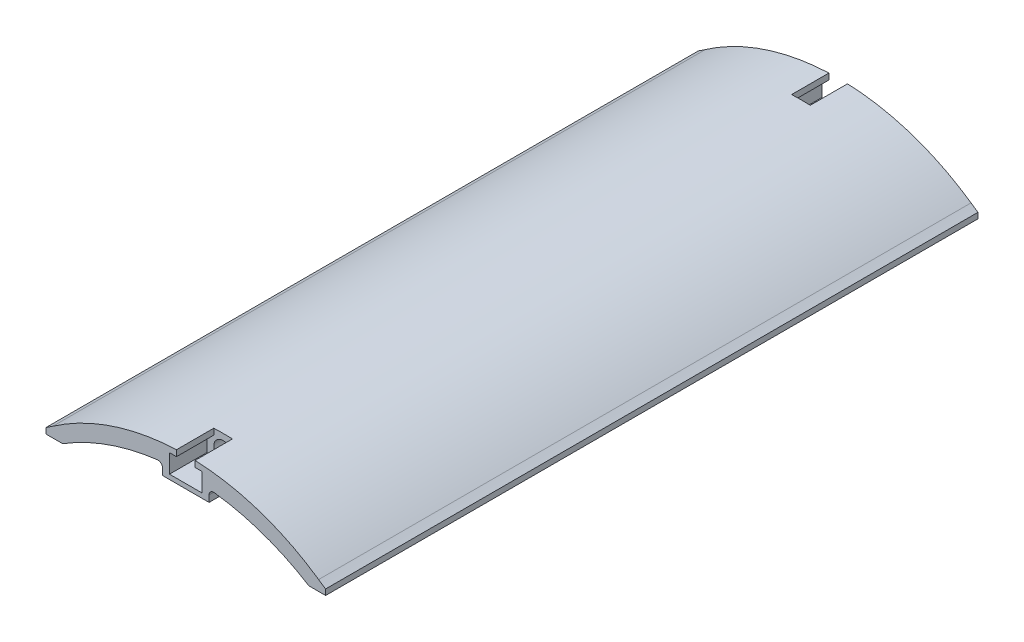
ISO-10303-21;
HEADER;
FILE_DESCRIPTION(('STEP AP214'),'2;1');
FILE_NAME('part.step','',(''),(''),'','','');
FILE_SCHEMA(('AUTOMOTIVE_DESIGN { 1 0 10303 214 1 1 1 1 }'));
ENDSEC;
DATA;
#1=APPLICATION_CONTEXT('core data for automotive mechanical design processes');
#2=APPLICATION_PROTOCOL_DEFINITION('international standard','automotive_design',2000,#1);
#3=PRODUCT_CONTEXT('',#1,'mechanical');
#4=PRODUCT('Part','Part','',(#3));
#5=PRODUCT_RELATED_PRODUCT_CATEGORY('part','',(#4));
#6=PRODUCT_DEFINITION_FORMATION('','',#4);
#7=PRODUCT_DEFINITION_CONTEXT('part definition',#1,'design');
#8=PRODUCT_DEFINITION('design','',#6,#7);
#9=PRODUCT_DEFINITION_SHAPE('','',#8);
#10=(LENGTH_UNIT() NAMED_UNIT(*) SI_UNIT(.MILLI.,.METRE.));
#11=(NAMED_UNIT(*) PLANE_ANGLE_UNIT() SI_UNIT($,.RADIAN.));
#12=(NAMED_UNIT(*) SI_UNIT($,.STERADIAN.) SOLID_ANGLE_UNIT());
#13=UNCERTAINTY_MEASURE_WITH_UNIT(LENGTH_MEASURE(1.E-05),#10,'distance_accuracy_value','');
#14=(GEOMETRIC_REPRESENTATION_CONTEXT(3) GLOBAL_UNCERTAINTY_ASSIGNED_CONTEXT((#13)) GLOBAL_UNIT_ASSIGNED_CONTEXT((#10,
#11,#12)) REPRESENTATION_CONTEXT('',''));
#15=CARTESIAN_POINT('',(0.,0.,0.));
#16=DIRECTION('',(0.,0.,1.));
#17=DIRECTION('',(1.,0.,0.));
#18=AXIS2_PLACEMENT_3D('',#15,#16,#17);
#19=CARTESIAN_POINT('',(-7.,56.1775325913685,133.702232430035));
#20=DIRECTION('',(0.,1.,0.));
#21=DIRECTION('',(0.,0.,1.));
#22=AXIS2_PLACEMENT_3D('',#19,#20,#21);
#23=PLANE('',#22);
#24=DIRECTION('',(0.,0.,-1.));
#25=VECTOR('',#24,1.);
#26=CARTESIAN_POINT('',(-4.,56.1775325913685,133.702232430035));
#27=LINE('',#26,#25);
#28=CARTESIAN_POINT('',(-4.,56.1775325913685,133.702232430035));
#29=VERTEX_POINT('',#28);
#30=CARTESIAN_POINT('',(-4.,56.1775325913685,117.702232430035));
#31=VERTEX_POINT('',#30);
#32=EDGE_CURVE('E452',#29,#31,#27,.T.);
#33=ORIENTED_EDGE('',*,*,#32,.F.);
#34=DIRECTION('',(1.,0.,0.));
#35=VECTOR('',#34,1.);
#36=CARTESIAN_POINT('',(-7.,56.1775325913685,133.702232430035));
#37=LINE('',#36,#35);
#38=CARTESIAN_POINT('',(-7.,56.1775325913685,133.702232430035));
#39=VERTEX_POINT('',#38);
#40=EDGE_CURVE('E466',#39,#29,#37,.T.);
#41=ORIENTED_EDGE('',*,*,#40,.F.);
#42=DIRECTION('',(0.,0.,-1.));
#43=VECTOR('',#42,1.);
#44=CARTESIAN_POINT('',(-7.,56.1775325913685,133.702232430035));
#45=LINE('',#44,#43);
#46=CARTESIAN_POINT('',(-7.,56.1775325913685,117.702232430035));
#47=VERTEX_POINT('',#46);
#48=EDGE_CURVE('E509',#39,#47,#45,.T.);
#49=ORIENTED_EDGE('',*,*,#48,.T.);
#50=DIRECTION('',(1.,0.,0.));
#51=VECTOR('',#50,1.);
#52=CARTESIAN_POINT('',(-7.,56.1775325913685,117.702232430035));
#53=LINE('',#52,#51);
#54=EDGE_CURVE('E470',#47,#31,#53,.T.);
#55=ORIENTED_EDGE('',*,*,#54,.T.);
#56=EDGE_LOOP('',(#33,#41,#49,#55));
#57=FACE_BOUND('',#56,.T.);
#58=ADVANCED_FACE('F250',(#57),#23,.F.);
#59=CARTESIAN_POINT('',(-60.,58.8562422233852,117.702232430035));
#60=DIRECTION('',(0.,0.,1.));
#61=DIRECTION('',(1.,0.,0.));
#62=AXIS2_PLACEMENT_3D('',#59,#60,#61);
#63=PLANE('',#62);
#64=CARTESIAN_POINT('',(0.,-41.1437827766148,117.702232430035));
#65=DIRECTION('',(0.,0.,1.));
#66=DIRECTION('',(1.,0.,0.));
#67=AXIS2_PLACEMENT_3D('',#64,#65,#66);
#68=CIRCLE('',#67,100.);
#69=CARTESIAN_POINT('',(-4.,58.7761851977596,117.702232430035));
#70=VERTEX_POINT('',#69);
#71=CARTESIAN_POINT('',(-57.0067439772401,41.0160075171378,117.702232430035));
#72=VERTEX_POINT('',#71);
#73=EDGE_CURVE('E253',#70,#72,#68,.T.);
#74=ORIENTED_EDGE('',*,*,#73,.F.);
#75=DIRECTION('',(0.,-1.,0.));
#76=VECTOR('',#75,1.);
#77=CARTESIAN_POINT('',(-4.,56.1775325913685,117.702232430035));
#78=LINE('',#77,#76);
#79=EDGE_CURVE('E1289',#70,#31,#78,.T.);
#80=ORIENTED_EDGE('',*,*,#79,.T.);
#81=ORIENTED_EDGE('',*,*,#54,.F.);
#82=DIRECTION('',(0.,1.,0.));
#83=VECTOR('',#82,1.);
#84=CARTESIAN_POINT('',(-7.,56.1775325913685,117.702232430035));
#85=LINE('',#84,#83);
#86=CARTESIAN_POINT('',(-7.,48.1775325913685,117.702232430035));
#87=VERTEX_POINT('',#86);
#88=EDGE_CURVE('E494',#87,#47,#85,.T.);
#89=ORIENTED_EDGE('',*,*,#88,.F.);
#90=DIRECTION('',(-1.,0.,0.));
#91=VECTOR('',#90,1.);
#92=CARTESIAN_POINT('',(-7.,48.1775325913685,117.702232430035));
#93=LINE('',#92,#91);
#94=CARTESIAN_POINT('',(7.,48.1775325913685,117.702232430035));
#95=VERTEX_POINT('',#94);
#96=EDGE_CURVE('E495',#95,#87,#93,.T.);
#97=ORIENTED_EDGE('',*,*,#96,.F.);
#98=DIRECTION('',(0.,-1.,0.));
#99=VECTOR('',#98,1.);
#100=CARTESIAN_POINT('',(7.,56.1775325913685,117.702232430035));
#101=LINE('',#100,#99);
#102=CARTESIAN_POINT('',(7.,56.1775325913685,117.702232430035));
#103=VERTEX_POINT('',#102);
#104=EDGE_CURVE('E486',#103,#95,#101,.T.);
#105=ORIENTED_EDGE('',*,*,#104,.F.);
#106=CARTESIAN_POINT('',(4.,56.1775325913685,117.702232430035));
#107=VERTEX_POINT('',#106);
#108=EDGE_CURVE('E497',#107,#103,#53,.T.);
#109=ORIENTED_EDGE('',*,*,#108,.F.);
#110=DIRECTION('',(0.,1.,0.));
#111=VECTOR('',#110,1.);
#112=CARTESIAN_POINT('',(4.,56.1775325913685,117.702232430035));
#113=LINE('',#112,#111);
#114=CARTESIAN_POINT('',(4.,58.7761851977596,117.702232430035));
#115=VERTEX_POINT('',#114);
#116=EDGE_CURVE('E463',#107,#115,#113,.T.);
#117=ORIENTED_EDGE('',*,*,#116,.T.);
#118=CARTESIAN_POINT('',(57.0067439772401,41.0160075171378,117.702232430035));
#119=VERTEX_POINT('',#118);
#120=EDGE_CURVE('E612',#119,#115,#68,.T.);
#121=ORIENTED_EDGE('',*,*,#120,.F.);
#122=CARTESIAN_POINT('',(114.01348795448,123.17579781089,117.702232430035));
#123=DIRECTION('',(0.,0.,1.));
#124=DIRECTION('',(1.,0.,0.));
#125=AXIS2_PLACEMENT_3D('',#122,#123,#124);
#126=CIRCLE('',#125,100.);
#127=CARTESIAN_POINT('',(60.,39.0179513615472,117.702232430035));
#128=VERTEX_POINT('',#127);
#129=EDGE_CURVE('E620',#128,#119,#126,.F.);
#130=ORIENTED_EDGE('',*,*,#129,.F.);
#131=DIRECTION('',(0.,1.,0.));
#132=VECTOR('',#131,1.);
#133=CARTESIAN_POINT('',(60.,58.8562422233852,117.702232430035));
#134=LINE('',#133,#132);
#135=CARTESIAN_POINT('',(60.,36.5787888807066,117.702232430035));
#136=VERTEX_POINT('',#135);
#137=EDGE_CURVE('E615',#128,#136,#134,.F.);
#138=ORIENTED_EDGE('',*,*,#137,.T.);
#139=DIRECTION('',(-1.,0.,0.));
#140=VECTOR('',#139,1.);
#141=CARTESIAN_POINT('',(60.000025,36.5787888807066,117.702232430035));
#142=LINE('',#141,#140);
#143=CARTESIAN_POINT('',(52.8392846280113,36.5787888807066,117.702232430035));
#144=VERTEX_POINT('',#143);
#145=EDGE_CURVE('E600',#136,#144,#142,.T.);
#146=ORIENTED_EDGE('',*,*,#145,.T.);
#147=CARTESIAN_POINT('',(0.,-48.3212111192935,117.702232430035));
#148=DIRECTION('',(0.,0.,1.));
#149=DIRECTION('',(1.,0.,0.));
#150=AXIS2_PLACEMENT_3D('',#147,#148,#149);
#151=CIRCLE('',#150,100.);
#152=CARTESIAN_POINT('',(12.2448979591837,50.9262698259133,117.702232430035));
#153=VERTEX_POINT('',#152);
#154=EDGE_CURVE('E631',#144,#153,#151,.T.);
#155=ORIENTED_EDGE('',*,*,#154,.T.);
#156=CARTESIAN_POINT('',(12.,48.9413202070092,117.702232430035));
#157=DIRECTION('',(0.,0.,1.));
#158=DIRECTION('',(1.,0.,0.));
#159=AXIS2_PLACEMENT_3D('',#156,#157,#158);
#160=CIRCLE('',#159,2.);
#161=CARTESIAN_POINT('',(10.,48.9413202070092,117.702232430035));
#162=VERTEX_POINT('',#161);
#163=EDGE_CURVE('E649',#153,#162,#160,.T.);
#164=ORIENTED_EDGE('',*,*,#163,.T.);
#165=DIRECTION('',(0.,-1.,0.));
#166=VECTOR('',#165,1.);
#167=CARTESIAN_POINT('',(10.,46.1775325913686,117.702232430035));
#168=LINE('',#167,#166);
#169=CARTESIAN_POINT('',(10.,46.1775325913686,117.702232430035));
#170=VERTEX_POINT('',#169);
#171=EDGE_CURVE('E575',#162,#170,#168,.T.);
#172=ORIENTED_EDGE('',*,*,#171,.T.);
#173=DIRECTION('',(-1.,0.,0.));
#174=VECTOR('',#173,1.);
#175=CARTESIAN_POINT('',(-10.,46.1775325913686,117.702232430035));
#176=LINE('',#175,#174);
#177=CARTESIAN_POINT('',(-10.,46.1775325913686,117.702232430035));
#178=VERTEX_POINT('',#177);
#179=EDGE_CURVE('E567',#170,#178,#176,.T.);
#180=ORIENTED_EDGE('',*,*,#179,.T.);
#181=DIRECTION('',(0.,1.,0.));
#182=VECTOR('',#181,1.);
#183=CARTESIAN_POINT('',(-10.,51.1775325913685,117.702232430035));
#184=LINE('',#183,#182);
#185=CARTESIAN_POINT('',(-10.,48.9413202070092,117.702232430035));
#186=VERTEX_POINT('',#185);
#187=EDGE_CURVE('E576',#178,#186,#184,.T.);
#188=ORIENTED_EDGE('',*,*,#187,.T.);
#189=CARTESIAN_POINT('',(-12.,48.9413202070092,117.702232430035));
#190=DIRECTION('',(0.,0.,1.));
#191=DIRECTION('',(1.,0.,0.));
#192=AXIS2_PLACEMENT_3D('',#189,#190,#191);
#193=CIRCLE('',#192,2.);
#194=CARTESIAN_POINT('',(-12.2448979591837,50.9262698259133,117.702232430035));
#195=VERTEX_POINT('',#194);
#196=EDGE_CURVE('E657',#186,#195,#193,.T.);
#197=ORIENTED_EDGE('',*,*,#196,.T.);
#198=CARTESIAN_POINT('',(-52.8392846280113,36.5787888807066,117.702232430035));
#199=VERTEX_POINT('',#198);
#200=EDGE_CURVE('E621',#195,#199,#151,.T.);
#201=ORIENTED_EDGE('',*,*,#200,.T.);
#202=CARTESIAN_POINT('',(-60.,36.5787888807066,117.702232430035));
#203=VERTEX_POINT('',#202);
#204=EDGE_CURVE('E605',#199,#203,#142,.T.);
#205=ORIENTED_EDGE('',*,*,#204,.T.);
#206=DIRECTION('',(0.,1.,0.));
#207=VECTOR('',#206,1.);
#208=CARTESIAN_POINT('',(-60.,58.8562422233852,117.702232430035));
#209=LINE('',#208,#207);
#210=CARTESIAN_POINT('',(-60.,39.0179513615473,117.702232430035));
#211=VERTEX_POINT('',#210);
#212=EDGE_CURVE('E701',#211,#203,#209,.F.);
#213=ORIENTED_EDGE('',*,*,#212,.F.);
#214=CARTESIAN_POINT('',(-114.01348795448,123.17579781089,117.702232430035));
#215=DIRECTION('',(0.,0.,1.));
#216=DIRECTION('',(1.,0.,0.));
#217=AXIS2_PLACEMENT_3D('',#214,#215,#216);
#218=CIRCLE('',#217,100.);
#219=EDGE_CURVE('E606',#72,#211,#218,.F.);
#220=ORIENTED_EDGE('',*,*,#219,.F.);
#221=EDGE_LOOP('',(#74,#80,#81,#89,#97,#105,#109,#117,#121,#130,#138,#146,#155,#164,#172,#180,
#188,#197,#201,#205,#213,#220));
#222=FACE_BOUND('',#221,.T.);
#223=ADVANCED_FACE('F747',(#222),#63,.F.);
#224=CARTESIAN_POINT('',(0.,-41.1437827766148,475.));
#225=DIRECTION('',(0.,0.,-1.));
#226=DIRECTION('',(-1.,0.,0.));
#227=AXIS2_PLACEMENT_3D('',#224,#225,#226);
#228=CYLINDRICAL_SURFACE('',#227,100.);
#229=DIRECTION('',(0.,0.,-1.));
#230=VECTOR('',#229,1.);
#231=CARTESIAN_POINT('',(4.,58.7761851977596,133.702232430035));
#232=LINE('',#231,#230);
#233=CARTESIAN_POINT('',(4.,58.7761851977596,133.702232430035));
#234=VERTEX_POINT('',#233);
#235=EDGE_CURVE('E846',#234,#115,#232,.T.);
#236=ORIENTED_EDGE('',*,*,#235,.F.);
#237=CARTESIAN_POINT('',(0.,-41.1437827766148,133.702232430035));
#238=DIRECTION('',(0.,0.,1.));
#239=DIRECTION('',(1.,0.,0.));
#240=AXIS2_PLACEMENT_3D('',#237,#238,#239);
#241=CIRCLE('',#240,100.);
#242=CARTESIAN_POINT('',(-4.,58.7761851977596,133.702232430035));
#243=VERTEX_POINT('',#242);
#244=EDGE_CURVE('E849',#234,#243,#241,.T.);
#245=ORIENTED_EDGE('',*,*,#244,.T.);
#246=DIRECTION('',(0.,0.,-1.));
#247=VECTOR('',#246,1.);
#248=CARTESIAN_POINT('',(-4.,58.7761851977596,133.702232430035));
#249=LINE('',#248,#247);
#250=EDGE_CURVE('E460',#243,#70,#249,.T.);
#251=ORIENTED_EDGE('',*,*,#250,.T.);
#252=ORIENTED_EDGE('',*,*,#73,.T.);
#253=CARTESIAN_POINT('',(-57.0067439772401,41.0160075171378,117.702232430035));
#254=DIRECTION('',(0.,0.,1.));
#255=VECTOR('',#254,1.);
#256=LINE('',#253,#255);
#257=CARTESIAN_POINT('',(-57.0067439772401,41.0160075171378,397.702232430035));
#258=VERTEX_POINT('',#257);
#259=EDGE_CURVE('E681',#72,#258,#256,.T.);
#260=ORIENTED_EDGE('',*,*,#259,.T.);
#261=CARTESIAN_POINT('',(0.,-41.1437827766148,397.702232430035));
#262=DIRECTION('',(0.,0.,-1.));
#263=DIRECTION('',(-1.,0.,0.));
#264=AXIS2_PLACEMENT_3D('',#261,#262,#263);
#265=CIRCLE('',#264,100.);
#266=CARTESIAN_POINT('',(-4.,58.7761851977596,397.702232430035));
#267=VERTEX_POINT('',#266);
#268=EDGE_CURVE('E638',#258,#267,#265,.T.);
#269=ORIENTED_EDGE('',*,*,#268,.T.);
#270=DIRECTION('',(0.,0.,1.));
#271=VECTOR('',#270,1.);
#272=CARTESIAN_POINT('',(-4.,58.7761851977596,381.702232430035));
#273=LINE('',#272,#271);
#274=CARTESIAN_POINT('',(-4.,58.7761851977596,381.702232430035));
#275=VERTEX_POINT('',#274);
#276=EDGE_CURVE('E879',#275,#267,#273,.T.);
#277=ORIENTED_EDGE('',*,*,#276,.F.);
#278=CARTESIAN_POINT('',(0.,-41.1437827766148,381.702232430035));
#279=DIRECTION('',(0.,0.,-1.));
#280=DIRECTION('',(-1.,0.,0.));
#281=AXIS2_PLACEMENT_3D('',#278,#279,#280);
#282=CIRCLE('',#281,100.);
#283=CARTESIAN_POINT('',(4.,58.7761851977596,381.702232430035));
#284=VERTEX_POINT('',#283);
#285=EDGE_CURVE('E493',#275,#284,#282,.T.);
#286=ORIENTED_EDGE('',*,*,#285,.T.);
#287=DIRECTION('',(0.,0.,1.));
#288=VECTOR('',#287,1.);
#289=CARTESIAN_POINT('',(4.,58.7761851977596,381.702232430035));
#290=LINE('',#289,#288);
#291=CARTESIAN_POINT('',(4.,58.7761851977596,397.702232430035));
#292=VERTEX_POINT('',#291);
#293=EDGE_CURVE('E839',#284,#292,#290,.T.);
#294=ORIENTED_EDGE('',*,*,#293,.T.);
#295=CARTESIAN_POINT('',(57.0067439772401,41.0160075171378,397.702232430035));
#296=VERTEX_POINT('',#295);
#297=EDGE_CURVE('E632',#292,#296,#265,.T.);
#298=ORIENTED_EDGE('',*,*,#297,.T.);
#299=CARTESIAN_POINT('',(57.0067439772401,41.0160075171378,397.702232430035));
#300=DIRECTION('',(0.,0.,-1.));
#301=VECTOR('',#300,1.);
#302=LINE('',#299,#301);
#303=EDGE_CURVE('E774',#296,#119,#302,.T.);
#304=ORIENTED_EDGE('',*,*,#303,.T.);
#305=ORIENTED_EDGE('',*,*,#120,.T.);
#306=EDGE_LOOP('',(#236,#245,#251,#252,#260,#269,#277,#286,#294,#298,#304,#305));
#307=FACE_BOUND('',#306,.T.);
#308=ADVANCED_FACE('F790',(#307),#228,.T.);
#309=CARTESIAN_POINT('',(-7.,56.1775325913685,381.702232430035));
#310=DIRECTION('',(0.,1.,0.));
#311=DIRECTION('',(0.,0.,1.));
#312=AXIS2_PLACEMENT_3D('',#309,#310,#311);
#313=PLANE('',#312);
#314=DIRECTION('',(0.,0.,1.));
#315=VECTOR('',#314,1.);
#316=CARTESIAN_POINT('',(4.,56.1775325913685,381.702232430035));
#317=LINE('',#316,#315);
#318=CARTESIAN_POINT('',(4.,56.1775325913685,381.702232430035));
#319=VERTEX_POINT('',#318);
#320=CARTESIAN_POINT('',(4.,56.1775325913685,397.702232430035));
#321=VERTEX_POINT('',#320);
#322=EDGE_CURVE('E840',#319,#321,#317,.T.);
#323=ORIENTED_EDGE('',*,*,#322,.F.);
#324=DIRECTION('',(-1.,0.,0.));
#325=VECTOR('',#324,1.);
#326=CARTESIAN_POINT('',(-7.,56.1775325913685,381.702232430035));
#327=LINE('',#326,#325);
#328=CARTESIAN_POINT('',(7.,56.1775325913685,381.702232430035));
#329=VERTEX_POINT('',#328);
#330=EDGE_CURVE('E517',#329,#319,#327,.T.);
#331=ORIENTED_EDGE('',*,*,#330,.F.);
#332=DIRECTION('',(0.,0.,1.));
#333=VECTOR('',#332,1.);
#334=CARTESIAN_POINT('',(7.,56.1775325913685,381.702232430035));
#335=LINE('',#334,#333);
#336=CARTESIAN_POINT('',(7.,56.1775325913685,397.702232430035));
#337=VERTEX_POINT('',#336);
#338=EDGE_CURVE('E535',#329,#337,#335,.T.);
#339=ORIENTED_EDGE('',*,*,#338,.T.);
#340=DIRECTION('',(-1.,0.,0.));
#341=VECTOR('',#340,1.);
#342=CARTESIAN_POINT('',(-7.,56.1775325913685,397.702232430035));
#343=LINE('',#342,#341);
#344=EDGE_CURVE('E540',#337,#321,#343,.T.);
#345=ORIENTED_EDGE('',*,*,#344,.T.);
#346=EDGE_LOOP('',(#323,#331,#339,#345));
#347=FACE_BOUND('',#346,.T.);
#348=ADVANCED_FACE('F815',(#347),#313,.F.);
#349=CARTESIAN_POINT('',(-60.,58.8562422233852,397.702232430035));
#350=DIRECTION('',(0.,0.,-1.));
#351=DIRECTION('',(-1.,0.,0.));
#352=AXIS2_PLACEMENT_3D('',#349,#350,#351);
#353=PLANE('',#352);
#354=DIRECTION('',(0.,1.,0.));
#355=VECTOR('',#354,1.);
#356=CARTESIAN_POINT('',(4.,56.1775325913685,397.702232430035));
#357=LINE('',#356,#355);
#358=EDGE_CURVE('E857',#321,#292,#357,.T.);
#359=ORIENTED_EDGE('',*,*,#358,.F.);
#360=ORIENTED_EDGE('',*,*,#344,.F.);
#361=DIRECTION('',(0.,1.,0.));
#362=VECTOR('',#361,1.);
#363=CARTESIAN_POINT('',(7.,56.1775325913685,397.702232430035));
#364=LINE('',#363,#362);
#365=CARTESIAN_POINT('',(7.,48.1775325913685,397.702232430035));
#366=VERTEX_POINT('',#365);
#367=EDGE_CURVE('E510',#366,#337,#364,.T.);
#368=ORIENTED_EDGE('',*,*,#367,.F.);
#369=DIRECTION('',(1.,0.,0.));
#370=VECTOR('',#369,1.);
#371=CARTESIAN_POINT('',(-7.,48.1775325913685,397.702232430035));
#372=LINE('',#371,#370);
#373=CARTESIAN_POINT('',(-7.,48.1775325913685,397.702232430035));
#374=VERTEX_POINT('',#373);
#375=EDGE_CURVE('E518',#374,#366,#372,.T.);
#376=ORIENTED_EDGE('',*,*,#375,.F.);
#377=DIRECTION('',(0.,-1.,0.));
#378=VECTOR('',#377,1.);
#379=CARTESIAN_POINT('',(-7.,56.1775325913685,397.702232430035));
#380=LINE('',#379,#378);
#381=CARTESIAN_POINT('',(-7.,56.1775325913685,397.702232430035));
#382=VERTEX_POINT('',#381);
#383=EDGE_CURVE('E544',#382,#374,#380,.T.);
#384=ORIENTED_EDGE('',*,*,#383,.F.);
#385=CARTESIAN_POINT('',(-4.,56.1775325913685,397.702232430035));
#386=VERTEX_POINT('',#385);
#387=EDGE_CURVE('E538',#386,#382,#343,.T.);
#388=ORIENTED_EDGE('',*,*,#387,.F.);
#389=DIRECTION('',(0.,-1.,0.));
#390=VECTOR('',#389,1.);
#391=CARTESIAN_POINT('',(-4.,56.1775325913685,397.702232430035));
#392=LINE('',#391,#390);
#393=EDGE_CURVE('E868',#267,#386,#392,.T.);
#394=ORIENTED_EDGE('',*,*,#393,.F.);
#395=ORIENTED_EDGE('',*,*,#268,.F.);
#396=CARTESIAN_POINT('',(-114.01348795448,123.17579781089,397.702232430035));
#397=DIRECTION('',(0.,0.,-1.));
#398=DIRECTION('',(-1.,0.,0.));
#399=AXIS2_PLACEMENT_3D('',#396,#397,#398);
#400=CIRCLE('',#399,100.);
#401=CARTESIAN_POINT('',(-60.,39.0179513615473,397.702232430035));
#402=VERTEX_POINT('',#401);
#403=EDGE_CURVE('E626',#402,#258,#400,.F.);
#404=ORIENTED_EDGE('',*,*,#403,.F.);
#405=DIRECTION('',(0.,1.,0.));
#406=VECTOR('',#405,1.);
#407=CARTESIAN_POINT('',(-60.,58.8562422233852,397.702232430035));
#408=LINE('',#407,#406);
#409=CARTESIAN_POINT('',(-60.,36.5787888807066,397.702232430035));
#410=VERTEX_POINT('',#409);
#411=EDGE_CURVE('E707',#402,#410,#408,.F.);
#412=ORIENTED_EDGE('',*,*,#411,.T.);
#413=DIRECTION('',(-1.,0.,0.));
#414=VECTOR('',#413,1.);
#415=CARTESIAN_POINT('',(60.0000250000001,36.5787888807066,397.702232430035));
#416=LINE('',#415,#414);
#417=CARTESIAN_POINT('',(-52.8392846280113,36.5787888807066,397.702232430035));
#418=VERTEX_POINT('',#417);
#419=EDGE_CURVE('E601',#418,#410,#416,.T.);
#420=ORIENTED_EDGE('',*,*,#419,.F.);
#421=CARTESIAN_POINT('',(0.,-48.3212111192935,397.702232430035));
#422=DIRECTION('',(0.,0.,-1.));
#423=DIRECTION('',(-1.,0.,0.));
#424=AXIS2_PLACEMENT_3D('',#421,#422,#423);
#425=CIRCLE('',#424,100.);
#426=CARTESIAN_POINT('',(-12.2448979591837,50.9262698259133,397.702232430035));
#427=VERTEX_POINT('',#426);
#428=EDGE_CURVE('E667',#418,#427,#425,.T.);
#429=ORIENTED_EDGE('',*,*,#428,.T.);
#430=CARTESIAN_POINT('',(-12.,48.9413202070092,397.702232430035));
#431=DIRECTION('',(0.,0.,-1.));
#432=DIRECTION('',(-1.,0.,0.));
#433=AXIS2_PLACEMENT_3D('',#430,#431,#432);
#434=CIRCLE('',#433,2.);
#435=CARTESIAN_POINT('',(-10.,48.9413202070092,397.702232430035));
#436=VERTEX_POINT('',#435);
#437=EDGE_CURVE('E656',#427,#436,#434,.T.);
#438=ORIENTED_EDGE('',*,*,#437,.T.);
#439=DIRECTION('',(0.,-1.,0.));
#440=VECTOR('',#439,1.);
#441=CARTESIAN_POINT('',(-10.,51.1775325913685,397.702232430035));
#442=LINE('',#441,#440);
#443=CARTESIAN_POINT('',(-10.,46.1775325913686,397.702232430035));
#444=VERTEX_POINT('',#443);
#445=EDGE_CURVE('E568',#436,#444,#442,.T.);
#446=ORIENTED_EDGE('',*,*,#445,.T.);
#447=DIRECTION('',(1.,0.,0.));
#448=VECTOR('',#447,1.);
#449=CARTESIAN_POINT('',(-10.,46.1775325913686,397.702232430035));
#450=LINE('',#449,#448);
#451=CARTESIAN_POINT('',(10.,46.1775325913686,397.702232430035));
#452=VERTEX_POINT('',#451);
#453=EDGE_CURVE('E578',#444,#452,#450,.T.);
#454=ORIENTED_EDGE('',*,*,#453,.T.);
#455=DIRECTION('',(0.,1.,0.));
#456=VECTOR('',#455,1.);
#457=CARTESIAN_POINT('',(10.,46.1775325913686,397.702232430035));
#458=LINE('',#457,#456);
#459=CARTESIAN_POINT('',(10.,48.9413202070092,397.702232430035));
#460=VERTEX_POINT('',#459);
#461=EDGE_CURVE('E584',#452,#460,#458,.T.);
#462=ORIENTED_EDGE('',*,*,#461,.T.);
#463=CARTESIAN_POINT('',(12.,48.9413202070092,397.702232430035));
#464=DIRECTION('',(0.,0.,-1.));
#465=DIRECTION('',(-1.,0.,0.));
#466=AXIS2_PLACEMENT_3D('',#463,#464,#465);
#467=CIRCLE('',#466,2.);
#468=CARTESIAN_POINT('',(12.2448979591837,50.9262698259133,397.702232430035));
#469=VERTEX_POINT('',#468);
#470=EDGE_CURVE('E652',#460,#469,#467,.T.);
#471=ORIENTED_EDGE('',*,*,#470,.T.);
#472=CARTESIAN_POINT('',(52.8392846280113,36.5787888807066,397.702232430035));
#473=VERTEX_POINT('',#472);
#474=EDGE_CURVE('E669',#469,#473,#425,.T.);
#475=ORIENTED_EDGE('',*,*,#474,.T.);
#476=CARTESIAN_POINT('',(60.,36.5787888807066,397.702232430035));
#477=VERTEX_POINT('',#476);
#478=EDGE_CURVE('E607',#477,#473,#416,.T.);
#479=ORIENTED_EDGE('',*,*,#478,.F.);
#480=DIRECTION('',(0.,1.,0.));
#481=VECTOR('',#480,1.);
#482=CARTESIAN_POINT('',(60.,58.8562422233852,397.702232430035));
#483=LINE('',#482,#481);
#484=CARTESIAN_POINT('',(60.,39.0179513615472,397.702232430035));
#485=VERTEX_POINT('',#484);
#486=EDGE_CURVE('E603',#485,#477,#483,.F.);
#487=ORIENTED_EDGE('',*,*,#486,.F.);
#488=CARTESIAN_POINT('',(114.01348795448,123.17579781089,397.702232430035));
#489=DIRECTION('',(0.,0.,-1.));
#490=DIRECTION('',(-1.,0.,0.));
#491=AXIS2_PLACEMENT_3D('',#488,#489,#490);
#492=CIRCLE('',#491,100.);
#493=EDGE_CURVE('E637',#296,#485,#492,.F.);
#494=ORIENTED_EDGE('',*,*,#493,.F.);
#495=ORIENTED_EDGE('',*,*,#297,.F.);
#496=EDGE_LOOP('',(#359,#360,#368,#376,#384,#388,#394,#395,#404,#412,#420,#429,#438,#446,#454,
#462,#471,#475,#479,#487,#494,#495));
#497=FACE_BOUND('',#496,.T.);
#498=ADVANCED_FACE('F740',(#497),#353,.F.);
#499=CARTESIAN_POINT('',(0.,-48.3212111192935,478.));
#500=DIRECTION('',(0.,0.,-1.));
#501=DIRECTION('',(-1.,0.,0.));
#502=AXIS2_PLACEMENT_3D('',#499,#500,#501);
#503=CYLINDRICAL_SURFACE('',#502,100.);
#504=ORIENTED_EDGE('',*,*,#200,.F.);
#505=DIRECTION('',(0.,0.,-1.));
#506=VECTOR('',#505,1.);
#507=CARTESIAN_POINT('',(-12.2448979591837,50.9262698259133,478.));
#508=LINE('',#507,#506);
#509=EDGE_CURVE('E693',#195,#427,#508,.F.);
#510=ORIENTED_EDGE('',*,*,#509,.T.);
#511=ORIENTED_EDGE('',*,*,#428,.F.);
#512=DIRECTION('',(0.,0.,-1.));
#513=VECTOR('',#512,1.);
#514=CARTESIAN_POINT('',(-52.8392846280113,36.5787888807066,478.));
#515=LINE('',#514,#513);
#516=EDGE_CURVE('E690',#199,#418,#515,.F.);
#517=ORIENTED_EDGE('',*,*,#516,.F.);
#518=EDGE_LOOP('',(#504,#510,#511,#517));
#519=FACE_BOUND('',#518,.T.);
#520=ADVANCED_FACE('F978',(#519),#503,.F.);
#521=CARTESIAN_POINT('',(-60.,58.8562422233852,117.702232430035));
#522=DIRECTION('',(1.,0.,0.));
#523=DIRECTION('',(0.,0.,-1.));
#524=AXIS2_PLACEMENT_3D('',#521,#522,#523);
#525=PLANE('',#524);
#526=DIRECTION('',(0.,0.,-1.));
#527=VECTOR('',#526,1.);
#528=CARTESIAN_POINT('',(-60.,36.5787888807066,117.702232430035));
#529=LINE('',#528,#527);
#530=EDGE_CURVE('E597',#410,#203,#529,.T.);
#531=ORIENTED_EDGE('',*,*,#530,.F.);
#532=ORIENTED_EDGE('',*,*,#411,.F.);
#533=DIRECTION('',(0.,0.,-1.));
#534=VECTOR('',#533,1.);
#535=CARTESIAN_POINT('',(-59.9999999999999,39.0179513615473,528.098003271384));
#536=LINE('',#535,#534);
#537=EDGE_CURVE('E680',#211,#402,#536,.F.);
#538=ORIENTED_EDGE('',*,*,#537,.F.);
#539=ORIENTED_EDGE('',*,*,#212,.T.);
#540=EDGE_LOOP('',(#531,#532,#538,#539));
#541=FACE_BOUND('',#540,.T.);
#542=ADVANCED_FACE('F768',(#541),#525,.F.);
#543=CARTESIAN_POINT('',(-114.01348795448,123.17579781089,528.098003271384));
#544=DIRECTION('',(0.,0.,-1.));
#545=DIRECTION('',(-1.,0.,0.));
#546=AXIS2_PLACEMENT_3D('',#543,#544,#545);
#547=CYLINDRICAL_SURFACE('',#546,100.);
#548=ORIENTED_EDGE('',*,*,#259,.F.);
#549=ORIENTED_EDGE('',*,*,#219,.T.);
#550=ORIENTED_EDGE('',*,*,#537,.T.);
#551=ORIENTED_EDGE('',*,*,#403,.T.);
#552=EDGE_LOOP('',(#548,#549,#550,#551));
#553=FACE_BOUND('',#552,.T.);
#554=ADVANCED_FACE('F818',(#553),#547,.F.);
#555=CARTESIAN_POINT('',(114.01348795448,123.17579781089,-97.2977675699654));
#556=DIRECTION('',(0.,0.,1.));
#557=DIRECTION('',(1.,0.,0.));
#558=AXIS2_PLACEMENT_3D('',#555,#556,#557);
#559=CYLINDRICAL_SURFACE('',#558,100.);
#560=DIRECTION('',(0.,0.,1.));
#561=VECTOR('',#560,1.);
#562=CARTESIAN_POINT('',(60.,39.0179513615472,-97.2977675699654));
#563=LINE('',#562,#561);
#564=EDGE_CURVE('E694',#485,#128,#563,.F.);
#565=ORIENTED_EDGE('',*,*,#564,.T.);
#566=ORIENTED_EDGE('',*,*,#129,.T.);
#567=ORIENTED_EDGE('',*,*,#303,.F.);
#568=ORIENTED_EDGE('',*,*,#493,.T.);
#569=EDGE_LOOP('',(#565,#566,#567,#568));
#570=FACE_BOUND('',#569,.T.);
#571=ADVANCED_FACE('F814',(#570),#559,.F.);
#572=CARTESIAN_POINT('',(60.,58.8562422233852,117.702232430035));
#573=DIRECTION('',(-1.,0.,0.));
#574=DIRECTION('',(0.,0.,1.));
#575=AXIS2_PLACEMENT_3D('',#572,#573,#574);
#576=PLANE('',#575);
#577=ORIENTED_EDGE('',*,*,#486,.T.);
#578=DIRECTION('',(0.,0.,1.));
#579=VECTOR('',#578,1.);
#580=CARTESIAN_POINT('',(60.,36.5787888807066,117.702232430035));
#581=LINE('',#580,#579);
#582=EDGE_CURVE('E610',#477,#136,#581,.F.);
#583=ORIENTED_EDGE('',*,*,#582,.T.);
#584=ORIENTED_EDGE('',*,*,#137,.F.);
#585=ORIENTED_EDGE('',*,*,#564,.F.);
#586=EDGE_LOOP('',(#577,#583,#584,#585));
#587=FACE_BOUND('',#586,.T.);
#588=ADVANCED_FACE('F820',(#587),#576,.F.);
#589=ORIENTED_EDGE('',*,*,#474,.F.);
#590=DIRECTION('',(0.,0.,-1.));
#591=VECTOR('',#590,1.);
#592=CARTESIAN_POINT('',(12.2448979591837,50.9262698259133,478.));
#593=LINE('',#592,#591);
#594=EDGE_CURVE('E665',#469,#153,#593,.T.);
#595=ORIENTED_EDGE('',*,*,#594,.T.);
#596=ORIENTED_EDGE('',*,*,#154,.F.);
#597=DIRECTION('',(0.,0.,-1.));
#598=VECTOR('',#597,1.);
#599=CARTESIAN_POINT('',(52.8392846280113,36.5787888807066,478.));
#600=LINE('',#599,#598);
#601=EDGE_CURVE('E687',#473,#144,#600,.T.);
#602=ORIENTED_EDGE('',*,*,#601,.F.);
#603=EDGE_LOOP('',(#589,#595,#596,#602));
#604=FACE_BOUND('',#603,.T.);
#605=ADVANCED_FACE('F753',(#604),#503,.F.);
#606=CARTESIAN_POINT('',(60.000025,36.5787888807066,117.702232430035));
#607=DIRECTION('',(0.,1.,0.));
#608=DIRECTION('',(0.,0.,1.));
#609=AXIS2_PLACEMENT_3D('',#606,#607,#608);
#610=PLANE('',#609);
#611=ORIENTED_EDGE('',*,*,#516,.T.);
#612=ORIENTED_EDGE('',*,*,#419,.T.);
#613=ORIENTED_EDGE('',*,*,#530,.T.);
#614=ORIENTED_EDGE('',*,*,#204,.F.);
#615=EDGE_LOOP('',(#611,#612,#613,#614));
#616=FACE_BOUND('',#615,.T.);
#617=ADVANCED_FACE('F988',(#616),#610,.F.);
#618=ORIENTED_EDGE('',*,*,#601,.T.);
#619=ORIENTED_EDGE('',*,*,#145,.F.);
#620=ORIENTED_EDGE('',*,*,#582,.F.);
#621=ORIENTED_EDGE('',*,*,#478,.T.);
#622=EDGE_LOOP('',(#618,#619,#620,#621));
#623=FACE_BOUND('',#622,.T.);
#624=ADVANCED_FACE('F760',(#623),#610,.F.);
#625=CARTESIAN_POINT('',(10.,46.1775325913686,96.9594307687122));
#626=DIRECTION('',(1.,0.,0.));
#627=DIRECTION('',(0.,1.,0.));
#628=AXIS2_PLACEMENT_3D('',#625,#626,#627);
#629=PLANE('',#628);
#630=ORIENTED_EDGE('',*,*,#171,.F.);
#631=DIRECTION('',(0.,0.,1.));
#632=VECTOR('',#631,1.);
#633=CARTESIAN_POINT('',(10.,48.9413202070092,397.702232430035));
#634=LINE('',#633,#632);
#635=EDGE_CURVE('E662',#162,#460,#634,.T.);
#636=ORIENTED_EDGE('',*,*,#635,.T.);
#637=ORIENTED_EDGE('',*,*,#461,.F.);
#638=DIRECTION('',(0.,0.,1.));
#639=VECTOR('',#638,1.);
#640=CARTESIAN_POINT('',(10.,46.1775325913686,96.9594307687122));
#641=LINE('',#640,#639);
#642=EDGE_CURVE('E573',#170,#452,#641,.T.);
#643=ORIENTED_EDGE('',*,*,#642,.F.);
#644=EDGE_LOOP('',(#630,#636,#637,#643));
#645=FACE_BOUND('',#644,.T.);
#646=ADVANCED_FACE('F732',(#645),#629,.T.);
#647=CARTESIAN_POINT('',(-10.,46.1775325913686,96.9594307687122));
#648=DIRECTION('',(0.,-1.,0.));
#649=DIRECTION('',(0.,0.,-1.));
#650=AXIS2_PLACEMENT_3D('',#647,#648,#649);
#651=PLANE('',#650);
#652=ORIENTED_EDGE('',*,*,#179,.F.);
#653=ORIENTED_EDGE('',*,*,#642,.T.);
#654=ORIENTED_EDGE('',*,*,#453,.F.);
#655=DIRECTION('',(0.,0.,1.));
#656=VECTOR('',#655,1.);
#657=CARTESIAN_POINT('',(-10.,46.1775325913686,96.9594307687122));
#658=LINE('',#657,#656);
#659=EDGE_CURVE('E590',#178,#444,#658,.T.);
#660=ORIENTED_EDGE('',*,*,#659,.F.);
#661=EDGE_LOOP('',(#652,#653,#654,#660));
#662=FACE_BOUND('',#661,.T.);
#663=ADVANCED_FACE('F745',(#662),#651,.T.);
#664=CARTESIAN_POINT('',(-10.,51.1775325913685,96.9594307687122));
#665=DIRECTION('',(-1.,0.,0.));
#666=DIRECTION('',(0.,-1.,0.));
#667=AXIS2_PLACEMENT_3D('',#664,#665,#666);
#668=PLANE('',#667);
#669=ORIENTED_EDGE('',*,*,#445,.F.);
#670=DIRECTION('',(0.,0.,1.));
#671=VECTOR('',#670,1.);
#672=CARTESIAN_POINT('',(-10.,48.9413202070092,117.702232430035));
#673=LINE('',#672,#671);
#674=EDGE_CURVE('E718',#436,#186,#673,.F.);
#675=ORIENTED_EDGE('',*,*,#674,.T.);
#676=ORIENTED_EDGE('',*,*,#187,.F.);
#677=ORIENTED_EDGE('',*,*,#659,.T.);
#678=EDGE_LOOP('',(#669,#675,#676,#677));
#679=FACE_BOUND('',#678,.T.);
#680=ADVANCED_FACE('F991',(#679),#668,.T.);
#681=CARTESIAN_POINT('',(-12.,48.9413202070092,478.));
#682=DIRECTION('',(0.,0.,-1.));
#683=DIRECTION('',(-1.,0.,0.));
#684=AXIS2_PLACEMENT_3D('',#681,#682,#683);
#685=CYLINDRICAL_SURFACE('',#684,2.);
#686=ORIENTED_EDGE('',*,*,#196,.F.);
#687=ORIENTED_EDGE('',*,*,#674,.F.);
#688=ORIENTED_EDGE('',*,*,#437,.F.);
#689=ORIENTED_EDGE('',*,*,#509,.F.);
#690=EDGE_LOOP('',(#686,#687,#688,#689));
#691=FACE_BOUND('',#690,.T.);
#692=ADVANCED_FACE('F992',(#691),#685,.F.);
#693=CARTESIAN_POINT('',(12.,48.9413202070092,478.));
#694=DIRECTION('',(0.,0.,-1.));
#695=DIRECTION('',(-1.,0.,0.));
#696=AXIS2_PLACEMENT_3D('',#693,#694,#695);
#697=CYLINDRICAL_SURFACE('',#696,2.);
#698=ORIENTED_EDGE('',*,*,#163,.F.);
#699=ORIENTED_EDGE('',*,*,#594,.F.);
#700=ORIENTED_EDGE('',*,*,#470,.F.);
#701=ORIENTED_EDGE('',*,*,#635,.F.);
#702=EDGE_LOOP('',(#698,#699,#700,#701));
#703=FACE_BOUND('',#702,.T.);
#704=ADVANCED_FACE('F249',(#703),#697,.F.);
#705=CARTESIAN_POINT('',(-7.,48.1775325913685,381.702232430035));
#706=DIRECTION('',(0.,-1.,0.));
#707=DIRECTION('',(0.,0.,-1.));
#708=AXIS2_PLACEMENT_3D('',#705,#706,#707);
#709=PLANE('',#708);
#710=ORIENTED_EDGE('',*,*,#375,.T.);
#711=DIRECTION('',(0.,0.,1.));
#712=VECTOR('',#711,1.);
#713=CARTESIAN_POINT('',(7.,48.1775325913685,381.702232430035));
#714=LINE('',#713,#712);
#715=CARTESIAN_POINT('',(7.,48.1775325913685,381.702232430035));
#716=VERTEX_POINT('',#715);
#717=EDGE_CURVE('E547',#716,#366,#714,.T.);
#718=ORIENTED_EDGE('',*,*,#717,.F.);
#719=DIRECTION('',(1.,0.,0.));
#720=VECTOR('',#719,1.);
#721=CARTESIAN_POINT('',(-7.,48.1775325913685,381.702232430035));
#722=LINE('',#721,#720);
#723=CARTESIAN_POINT('',(0.,48.1775325913685,381.702232430035));
#724=VERTEX_POINT('',#723);
#725=EDGE_CURVE('E530',#724,#716,#722,.T.);
#726=ORIENTED_EDGE('',*,*,#725,.F.);
#727=CARTESIAN_POINT('',(-7.,48.1775325913685,381.702232430035));
#728=VERTEX_POINT('',#727);
#729=EDGE_CURVE('E526',#728,#724,#722,.T.);
#730=ORIENTED_EDGE('',*,*,#729,.F.);
#731=DIRECTION('',(0.,0.,1.));
#732=VECTOR('',#731,1.);
#733=CARTESIAN_POINT('',(-7.,48.1775325913685,381.702232430035));
#734=LINE('',#733,#732);
#735=EDGE_CURVE('E553',#728,#374,#734,.T.);
#736=ORIENTED_EDGE('',*,*,#735,.T.);
#737=EDGE_LOOP('',(#710,#718,#726,#730,#736));
#738=FACE_BOUND('',#737,.T.);
#739=ADVANCED_FACE('F944',(#738),#709,.F.);
#740=CARTESIAN_POINT('',(-4.,56.1775325913685,381.702232430035));
#741=VERTEX_POINT('',#740);
#742=CARTESIAN_POINT('',(-7.,56.1775325913685,381.702232430035));
#743=VERTEX_POINT('',#742);
#744=EDGE_CURVE('E520',#741,#743,#327,.T.);
#745=ORIENTED_EDGE('',*,*,#744,.F.);
#746=DIRECTION('',(0.,0.,1.));
#747=VECTOR('',#746,1.);
#748=CARTESIAN_POINT('',(-4.,56.1775325913685,381.702232430035));
#749=LINE('',#748,#747);
#750=EDGE_CURVE('E876',#741,#386,#749,.T.);
#751=ORIENTED_EDGE('',*,*,#750,.T.);
#752=ORIENTED_EDGE('',*,*,#387,.T.);
#753=DIRECTION('',(0.,0.,1.));
#754=VECTOR('',#753,1.);
#755=CARTESIAN_POINT('',(-7.,56.1775325913685,381.702232430035));
#756=LINE('',#755,#754);
#757=EDGE_CURVE('E552',#743,#382,#756,.T.);
#758=ORIENTED_EDGE('',*,*,#757,.F.);
#759=EDGE_LOOP('',(#745,#751,#752,#758));
#760=FACE_BOUND('',#759,.T.);
#761=ADVANCED_FACE('F964',(#760),#313,.F.);
#762=CARTESIAN_POINT('',(0.,0.,381.702232430035));
#763=DIRECTION('',(0.,0.,1.));
#764=DIRECTION('',(1.,0.,0.));
#765=AXIS2_PLACEMENT_3D('',#762,#763,#764);
#766=PLANE('',#765);
#767=ORIENTED_EDGE('',*,*,#729,.T.);
#768=CARTESIAN_POINT('',(0.,52.1775325913686,381.702232430035));
#769=DIRECTION('',(0.,0.,1.));
#770=DIRECTION('',(1.,0.,0.));
#771=AXIS2_PLACEMENT_3D('',#768,#769,#770);
#772=CIRCLE('',#771,4.00000000000001);
#773=EDGE_CURVE('E256',#724,#724,#772,.F.);
#774=ORIENTED_EDGE('',*,*,#773,.T.);
#775=ORIENTED_EDGE('',*,*,#725,.T.);
#776=DIRECTION('',(0.,1.,0.));
#777=VECTOR('',#776,1.);
#778=CARTESIAN_POINT('',(7.,56.1775325913685,381.702232430035));
#779=LINE('',#778,#777);
#780=EDGE_CURVE('E514',#716,#329,#779,.T.);
#781=ORIENTED_EDGE('',*,*,#780,.T.);
#782=ORIENTED_EDGE('',*,*,#330,.T.);
#783=DIRECTION('',(0.,1.,0.));
#784=VECTOR('',#783,1.);
#785=CARTESIAN_POINT('',(4.,56.1775325913685,381.702232430035));
#786=LINE('',#785,#784);
#787=EDGE_CURVE('E272',#319,#284,#786,.T.);
#788=ORIENTED_EDGE('',*,*,#787,.T.);
#789=ORIENTED_EDGE('',*,*,#285,.F.);
#790=DIRECTION('',(0.,-1.,0.));
#791=VECTOR('',#790,1.);
#792=CARTESIAN_POINT('',(-4.,56.1775325913685,381.702232430035));
#793=LINE('',#792,#791);
#794=EDGE_CURVE('E837',#275,#741,#793,.T.);
#795=ORIENTED_EDGE('',*,*,#794,.T.);
#796=ORIENTED_EDGE('',*,*,#744,.T.);
#797=DIRECTION('',(0.,-1.,0.));
#798=VECTOR('',#797,1.);
#799=CARTESIAN_POINT('',(-7.,56.1775325913685,381.702232430035));
#800=LINE('',#799,#798);
#801=EDGE_CURVE('E523',#743,#728,#800,.T.);
#802=ORIENTED_EDGE('',*,*,#801,.T.);
#803=EDGE_LOOP('',(#767,#774,#775,#781,#782,#788,#789,#795,#796,#802));
#804=FACE_BOUND('',#803,.T.);
#805=ADVANCED_FACE('F941',(#804),#766,.T.);
#806=CARTESIAN_POINT('',(7.,56.1775325913685,381.702232430035));
#807=DIRECTION('',(1.,0.,0.));
#808=DIRECTION('',(0.,1.,0.));
#809=AXIS2_PLACEMENT_3D('',#806,#807,#808);
#810=PLANE('',#809);
#811=ORIENTED_EDGE('',*,*,#367,.T.);
#812=ORIENTED_EDGE('',*,*,#338,.F.);
#813=ORIENTED_EDGE('',*,*,#780,.F.);
#814=ORIENTED_EDGE('',*,*,#717,.T.);
#815=EDGE_LOOP('',(#811,#812,#813,#814));
#816=FACE_BOUND('',#815,.T.);
#817=ADVANCED_FACE('F947',(#816),#810,.F.);
#818=CARTESIAN_POINT('',(-7.,56.1775325913685,381.702232430035));
#819=DIRECTION('',(-1.,0.,0.));
#820=DIRECTION('',(0.,-1.,0.));
#821=AXIS2_PLACEMENT_3D('',#818,#819,#820);
#822=PLANE('',#821);
#823=ORIENTED_EDGE('',*,*,#383,.T.);
#824=ORIENTED_EDGE('',*,*,#735,.F.);
#825=ORIENTED_EDGE('',*,*,#801,.F.);
#826=ORIENTED_EDGE('',*,*,#757,.T.);
#827=EDGE_LOOP('',(#823,#824,#825,#826));
#828=FACE_BOUND('',#827,.T.);
#829=ADVANCED_FACE('F956',(#828),#822,.F.);
#830=CARTESIAN_POINT('',(0.,52.1775325913686,357.702232430035));
#831=DIRECTION('',(0.,0.,1.));
#832=DIRECTION('',(1.,0.,0.));
#833=AXIS2_PLACEMENT_3D('',#830,#831,#832);
#834=PLANE('',#833);
#835=CARTESIAN_POINT('',(0.,52.1775325913686,357.702232430035));
#836=DIRECTION('',(0.,0.,1.));
#837=DIRECTION('',(1.,0.,0.));
#838=AXIS2_PLACEMENT_3D('',#835,#836,#837);
#839=CIRCLE('',#838,4.00000000000001);
#840=CARTESIAN_POINT('',(4.00000000000001,52.1775325913686,357.702232430035));
#841=VERTEX_POINT('',#840);
#842=EDGE_CURVE('E564',#841,#841,#839,.T.);
#843=ORIENTED_EDGE('',*,*,#842,.T.);
#844=EDGE_LOOP('',(#843));
#845=FACE_BOUND('',#844,.T.);
#846=ADVANCED_FACE('F932',(#845),#834,.T.);
#847=CARTESIAN_POINT('',(0.,52.1775325913686,357.702232430035));
#848=DIRECTION('',(0.,0.,1.));
#849=DIRECTION('',(1.,0.,0.));
#850=AXIS2_PLACEMENT_3D('',#847,#848,#849);
#851=CYLINDRICAL_SURFACE('',#850,4.00000000000001);
#852=ORIENTED_EDGE('',*,*,#842,.F.);
#853=EDGE_LOOP('',(#852));
#854=FACE_BOUND('',#853,.T.);
#855=ORIENTED_EDGE('',*,*,#773,.F.);
#856=EDGE_LOOP('',(#855));
#857=FACE_BOUND('',#856,.T.);
#858=ADVANCED_FACE('F930',(#854,#857),#851,.F.);
#859=CARTESIAN_POINT('',(4.,56.1775325913685,133.702232430035));
#860=VERTEX_POINT('',#859);
#861=CARTESIAN_POINT('',(7.,56.1775325913685,133.702232430035));
#862=VERTEX_POINT('',#861);
#863=EDGE_CURVE('E480',#860,#862,#37,.T.);
#864=ORIENTED_EDGE('',*,*,#863,.F.);
#865=DIRECTION('',(0.,0.,-1.));
#866=VECTOR('',#865,1.);
#867=CARTESIAN_POINT('',(4.,56.1775325913685,133.702232430035));
#868=LINE('',#867,#866);
#869=EDGE_CURVE('E850',#860,#107,#868,.T.);
#870=ORIENTED_EDGE('',*,*,#869,.T.);
#871=ORIENTED_EDGE('',*,*,#108,.T.);
#872=DIRECTION('',(0.,0.,-1.));
#873=VECTOR('',#872,1.);
#874=CARTESIAN_POINT('',(7.,56.1775325913685,133.702232430035));
#875=LINE('',#874,#873);
#876=EDGE_CURVE('E502',#862,#103,#875,.T.);
#877=ORIENTED_EDGE('',*,*,#876,.F.);
#878=EDGE_LOOP('',(#864,#870,#871,#877));
#879=FACE_BOUND('',#878,.T.);
#880=ADVANCED_FACE('F922',(#879),#23,.F.);
#881=CARTESIAN_POINT('',(-7.,48.1775325913685,133.702232430035));
#882=DIRECTION('',(0.,-1.,0.));
#883=DIRECTION('',(0.,0.,-1.));
#884=AXIS2_PLACEMENT_3D('',#881,#882,#883);
#885=PLANE('',#884);
#886=ORIENTED_EDGE('',*,*,#96,.T.);
#887=DIRECTION('',(0.,0.,-1.));
#888=VECTOR('',#887,1.);
#889=CARTESIAN_POINT('',(-7.,48.1775325913685,133.702232430035));
#890=LINE('',#889,#888);
#891=CARTESIAN_POINT('',(-7.,48.1775325913685,133.702232430035));
#892=VERTEX_POINT('',#891);
#893=EDGE_CURVE('E482',#892,#87,#890,.T.);
#894=ORIENTED_EDGE('',*,*,#893,.F.);
#895=DIRECTION('',(-1.,0.,0.));
#896=VECTOR('',#895,1.);
#897=CARTESIAN_POINT('',(-7.,48.1775325913685,133.702232430035));
#898=LINE('',#897,#896);
#899=CARTESIAN_POINT('',(0.,48.1775325913685,133.702232430035));
#900=VERTEX_POINT('',#899);
#901=EDGE_CURVE('E842',#900,#892,#898,.T.);
#902=ORIENTED_EDGE('',*,*,#901,.F.);
#903=CARTESIAN_POINT('',(7.,48.1775325913685,133.702232430035));
#904=VERTEX_POINT('',#903);
#905=EDGE_CURVE('E841',#904,#900,#898,.T.);
#906=ORIENTED_EDGE('',*,*,#905,.F.);
#907=DIRECTION('',(0.,0.,-1.));
#908=VECTOR('',#907,1.);
#909=CARTESIAN_POINT('',(7.,48.1775325913685,133.702232430035));
#910=LINE('',#909,#908);
#911=EDGE_CURVE('E478',#904,#95,#910,.T.);
#912=ORIENTED_EDGE('',*,*,#911,.T.);
#913=EDGE_LOOP('',(#886,#894,#902,#906,#912));
#914=FACE_BOUND('',#913,.T.);
#915=ADVANCED_FACE('F896',(#914),#885,.F.);
#916=CARTESIAN_POINT('',(0.,0.,133.702232430035));
#917=DIRECTION('',(0.,0.,1.));
#918=DIRECTION('',(1.,0.,0.));
#919=AXIS2_PLACEMENT_3D('',#916,#917,#918);
#920=PLANE('',#919);
#921=ORIENTED_EDGE('',*,*,#901,.T.);
#922=DIRECTION('',(0.,1.,0.));
#923=VECTOR('',#922,1.);
#924=CARTESIAN_POINT('',(-7.,56.1775325913685,133.702232430035));
#925=LINE('',#924,#923);
#926=EDGE_CURVE('E474',#892,#39,#925,.T.);
#927=ORIENTED_EDGE('',*,*,#926,.T.);
#928=ORIENTED_EDGE('',*,*,#40,.T.);
#929=DIRECTION('',(0.,-1.,0.));
#930=VECTOR('',#929,1.);
#931=CARTESIAN_POINT('',(-4.,56.1775325913685,133.702232430035));
#932=LINE('',#931,#930);
#933=EDGE_CURVE('E266',#243,#29,#932,.T.);
#934=ORIENTED_EDGE('',*,*,#933,.F.);
#935=ORIENTED_EDGE('',*,*,#244,.F.);
#936=DIRECTION('',(0.,1.,0.));
#937=VECTOR('',#936,1.);
#938=CARTESIAN_POINT('',(4.,56.1775325913685,133.702232430035));
#939=LINE('',#938,#937);
#940=EDGE_CURVE('E458',#860,#234,#939,.T.);
#941=ORIENTED_EDGE('',*,*,#940,.F.);
#942=ORIENTED_EDGE('',*,*,#863,.T.);
#943=DIRECTION('',(0.,-1.,0.));
#944=VECTOR('',#943,1.);
#945=CARTESIAN_POINT('',(7.,56.1775325913685,133.702232430035));
#946=LINE('',#945,#944);
#947=EDGE_CURVE('E505',#862,#904,#946,.T.);
#948=ORIENTED_EDGE('',*,*,#947,.T.);
#949=ORIENTED_EDGE('',*,*,#905,.T.);
#950=CARTESIAN_POINT('',(0.,52.1775325913686,133.702232430035));
#951=DIRECTION('',(0.,0.,1.));
#952=DIRECTION('',(1.,0.,0.));
#953=AXIS2_PLACEMENT_3D('',#950,#951,#952);
#954=CIRCLE('',#953,4.00000000000001);
#955=EDGE_CURVE('E13',#900,#900,#954,.F.);
#956=ORIENTED_EDGE('',*,*,#955,.F.);
#957=EDGE_LOOP('',(#921,#927,#928,#934,#935,#941,#942,#948,#949,#956));
#958=FACE_BOUND('',#957,.T.);
#959=ADVANCED_FACE('F475',(#958),#920,.F.);
#960=CARTESIAN_POINT('',(7.,56.1775325913685,133.702232430035));
#961=DIRECTION('',(1.,0.,0.));
#962=DIRECTION('',(0.,0.,-1.));
#963=AXIS2_PLACEMENT_3D('',#960,#961,#962);
#964=PLANE('',#963);
#965=ORIENTED_EDGE('',*,*,#104,.T.);
#966=ORIENTED_EDGE('',*,*,#911,.F.);
#967=ORIENTED_EDGE('',*,*,#947,.F.);
#968=ORIENTED_EDGE('',*,*,#876,.T.);
#969=EDGE_LOOP('',(#965,#966,#967,#968));
#970=FACE_BOUND('',#969,.T.);
#971=ADVANCED_FACE('F897',(#970),#964,.F.);
#972=CARTESIAN_POINT('',(-7.,56.1775325913685,133.702232430035));
#973=DIRECTION('',(-1.,0.,0.));
#974=DIRECTION('',(0.,-1.,0.));
#975=AXIS2_PLACEMENT_3D('',#972,#973,#974);
#976=PLANE('',#975);
#977=ORIENTED_EDGE('',*,*,#88,.T.);
#978=ORIENTED_EDGE('',*,*,#48,.F.);
#979=ORIENTED_EDGE('',*,*,#926,.F.);
#980=ORIENTED_EDGE('',*,*,#893,.T.);
#981=EDGE_LOOP('',(#977,#978,#979,#980));
#982=FACE_BOUND('',#981,.T.);
#983=ADVANCED_FACE('F915',(#982),#976,.F.);
#984=CARTESIAN_POINT('',(0.,52.1775325913686,157.702232430035));
#985=DIRECTION('',(0.,0.,-1.));
#986=DIRECTION('',(-1.,0.,0.));
#987=AXIS2_PLACEMENT_3D('',#984,#985,#986);
#988=PLANE('',#987);
#989=CARTESIAN_POINT('',(0.,52.1775325913686,157.702232430035));
#990=DIRECTION('',(0.,0.,-1.));
#991=DIRECTION('',(-1.,0.,0.));
#992=AXIS2_PLACEMENT_3D('',#989,#990,#991);
#993=CIRCLE('',#992,4.00000000000001);
#994=CARTESIAN_POINT('',(-4.00000000000001,52.1775325913686,157.702232430035));
#995=VERTEX_POINT('',#994);
#996=EDGE_CURVE('E546',#995,#995,#993,.T.);
#997=ORIENTED_EDGE('',*,*,#996,.T.);
#998=EDGE_LOOP('',(#997));
#999=FACE_BOUND('',#998,.T.);
#1000=ADVANCED_FACE('F910',(#999),#988,.T.);
#1001=CARTESIAN_POINT('',(0.,52.1775325913686,157.702232430035));
#1002=DIRECTION('',(0.,0.,-1.));
#1003=DIRECTION('',(-1.,0.,0.));
#1004=AXIS2_PLACEMENT_3D('',#1001,#1002,#1003);
#1005=CYLINDRICAL_SURFACE('',#1004,4.00000000000001);
#1006=ORIENTED_EDGE('',*,*,#955,.T.);
#1007=EDGE_LOOP('',(#1006));
#1008=FACE_BOUND('',#1007,.T.);
#1009=ORIENTED_EDGE('',*,*,#996,.F.);
#1010=EDGE_LOOP('',(#1009));
#1011=FACE_BOUND('',#1010,.T.);
#1012=ADVANCED_FACE('F901',(#1008,#1011),#1005,.F.);
#1013=CARTESIAN_POINT('',(-4.,56.1775325913685,381.702232430035));
#1014=DIRECTION('',(-1.,0.,0.));
#1015=DIRECTION('',(0.,-1.,0.));
#1016=AXIS2_PLACEMENT_3D('',#1013,#1014,#1015);
#1017=PLANE('',#1016);
#1018=ORIENTED_EDGE('',*,*,#393,.T.);
#1019=ORIENTED_EDGE('',*,*,#750,.F.);
#1020=ORIENTED_EDGE('',*,*,#794,.F.);
#1021=ORIENTED_EDGE('',*,*,#276,.T.);
#1022=EDGE_LOOP('',(#1018,#1019,#1020,#1021));
#1023=FACE_BOUND('',#1022,.T.);
#1024=ADVANCED_FACE('F907',(#1023),#1017,.F.);
#1025=CARTESIAN_POINT('',(4.,56.1775325913685,381.702232430035));
#1026=DIRECTION('',(1.,0.,0.));
#1027=DIRECTION('',(0.,1.,0.));
#1028=AXIS2_PLACEMENT_3D('',#1025,#1026,#1027);
#1029=PLANE('',#1028);
#1030=ORIENTED_EDGE('',*,*,#358,.T.);
#1031=ORIENTED_EDGE('',*,*,#293,.F.);
#1032=ORIENTED_EDGE('',*,*,#787,.F.);
#1033=ORIENTED_EDGE('',*,*,#322,.T.);
#1034=EDGE_LOOP('',(#1030,#1031,#1032,#1033));
#1035=FACE_BOUND('',#1034,.T.);
#1036=ADVANCED_FACE('F953',(#1035),#1029,.F.);
#1037=CARTESIAN_POINT('',(4.,56.1775325913685,133.702232430035));
#1038=DIRECTION('',(-1.,0.,0.));
#1039=DIRECTION('',(0.,-1.,0.));
#1040=AXIS2_PLACEMENT_3D('',#1037,#1038,#1039);
#1041=PLANE('',#1040);
#1042=ORIENTED_EDGE('',*,*,#116,.F.);
#1043=ORIENTED_EDGE('',*,*,#869,.F.);
#1044=ORIENTED_EDGE('',*,*,#940,.T.);
#1045=ORIENTED_EDGE('',*,*,#235,.T.);
#1046=EDGE_LOOP('',(#1042,#1043,#1044,#1045));
#1047=FACE_BOUND('',#1046,.T.);
#1048=ADVANCED_FACE('F1143',(#1047),#1041,.T.);
#1049=CARTESIAN_POINT('',(-4.,56.1775325913685,133.702232430035));
#1050=DIRECTION('',(1.,0.,0.));
#1051=DIRECTION('',(0.,1.,0.));
#1052=AXIS2_PLACEMENT_3D('',#1049,#1050,#1051);
#1053=PLANE('',#1052);
#1054=ORIENTED_EDGE('',*,*,#79,.F.);
#1055=ORIENTED_EDGE('',*,*,#250,.F.);
#1056=ORIENTED_EDGE('',*,*,#933,.T.);
#1057=ORIENTED_EDGE('',*,*,#32,.T.);
#1058=EDGE_LOOP('',(#1054,#1055,#1056,#1057));
#1059=FACE_BOUND('',#1058,.T.);
#1060=ADVANCED_FACE('F451',(#1059),#1053,.T.);
#1061=CLOSED_SHELL('',(#58,#223,#308,#348,#498,#520,#542,#554,#571,#588,#605,#617,#624,#646,
#663,#680,#692,#704,#739,#761,#805,#817,#829,#846,#858,#880,#915,#959,#971,#983,#1000,#1012,
#1024,#1036,#1048,#1060));
#1062=MANIFOLD_SOLID_BREP('B2',#1061);
#1063=ADVANCED_BREP_SHAPE_REPRESENTATION('',(#18,#1062),#14);
#1064=SHAPE_DEFINITION_REPRESENTATION(#9,#1063);
ENDSEC;
END-ISO-10303-21;
